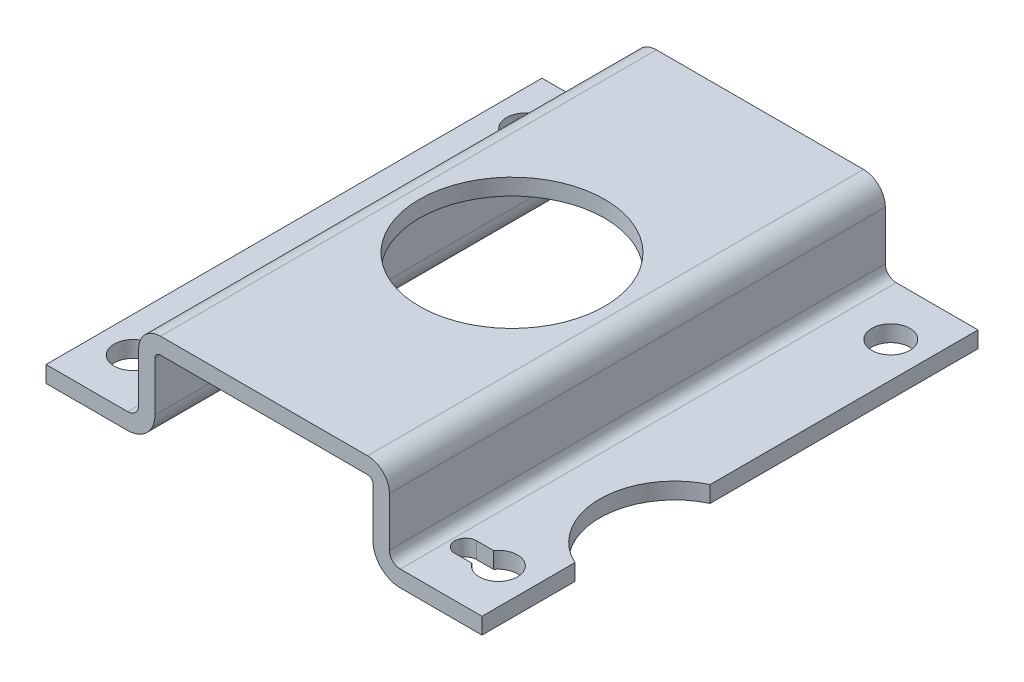
ISO-10303-21;
HEADER;
FILE_DESCRIPTION(('STEP AP214'),'2;1');
FILE_NAME('part.step','',(''),(''),'','','');
FILE_SCHEMA(('AUTOMOTIVE_DESIGN { 1 0 10303 214 1 1 1 1 }'));
ENDSEC;
DATA;
#1=APPLICATION_CONTEXT('core data for automotive mechanical design processes');
#2=APPLICATION_PROTOCOL_DEFINITION('international standard','automotive_design',2000,#1);
#3=PRODUCT_CONTEXT('',#1,'mechanical');
#4=PRODUCT('Part','Part','',(#3));
#5=PRODUCT_RELATED_PRODUCT_CATEGORY('part','',(#4));
#6=PRODUCT_DEFINITION_FORMATION('','',#4);
#7=PRODUCT_DEFINITION_CONTEXT('part definition',#1,'design');
#8=PRODUCT_DEFINITION('design','',#6,#7);
#9=PRODUCT_DEFINITION_SHAPE('','',#8);
#10=(LENGTH_UNIT() NAMED_UNIT(*) SI_UNIT(.MILLI.,.METRE.));
#11=(NAMED_UNIT(*) PLANE_ANGLE_UNIT() SI_UNIT($,.RADIAN.));
#12=(NAMED_UNIT(*) SI_UNIT($,.STERADIAN.) SOLID_ANGLE_UNIT());
#13=UNCERTAINTY_MEASURE_WITH_UNIT(LENGTH_MEASURE(1.E-05),#10,'distance_accuracy_value','');
#14=(GEOMETRIC_REPRESENTATION_CONTEXT(3) GLOBAL_UNCERTAINTY_ASSIGNED_CONTEXT((#13)) GLOBAL_UNIT_ASSIGNED_CONTEXT((#10,
#11,#12)) REPRESENTATION_CONTEXT('',''));
#15=CARTESIAN_POINT('',(0.,0.,0.));
#16=DIRECTION('',(0.,0.,1.));
#17=DIRECTION('',(1.,0.,0.));
#18=AXIS2_PLACEMENT_3D('',#15,#16,#17);
#19=CARTESIAN_POINT('',(40.,0.,45.5));
#20=DIRECTION('',(-1.,0.,0.));
#21=DIRECTION('',(0.,0.,1.));
#22=AXIS2_PLACEMENT_3D('',#19,#20,#21);
#23=PLANE('',#22);
#24=DIRECTION('',(0.,0.,-1.));
#25=VECTOR('',#24,1.);
#26=CARTESIAN_POINT('',(40.,3.,45.5));
#27=LINE('',#26,#25);
#28=CARTESIAN_POINT('',(40.,3.,3.6459415934201));
#29=VERTEX_POINT('',#28);
#30=CARTESIAN_POINT('',(40.,3.,-45.5));
#31=VERTEX_POINT('',#30);
#32=EDGE_CURVE('E472',#29,#31,#27,.T.);
#33=ORIENTED_EDGE('',*,*,#32,.F.);
#34=DIRECTION('',(0.,-1.,0.));
#35=VECTOR('',#34,1.);
#36=CARTESIAN_POINT('',(40.,10.,3.6459415934201));
#37=LINE('',#36,#35);
#38=CARTESIAN_POINT('',(40.,0.,3.6459415934201));
#39=VERTEX_POINT('',#38);
#40=EDGE_CURVE('E51',#29,#39,#37,.T.);
#41=ORIENTED_EDGE('',*,*,#40,.T.);
#42=DIRECTION('',(0.,0.,-1.));
#43=VECTOR('',#42,1.);
#44=CARTESIAN_POINT('',(40.,0.,45.5));
#45=LINE('',#44,#43);
#46=CARTESIAN_POINT('',(40.,0.,-45.5));
#47=VERTEX_POINT('',#46);
#48=EDGE_CURVE('E248',#39,#47,#45,.T.);
#49=ORIENTED_EDGE('',*,*,#48,.T.);
#50=DIRECTION('',(0.,1.,0.));
#51=VECTOR('',#50,1.);
#52=CARTESIAN_POINT('',(40.,0.,-45.5));
#53=LINE('',#52,#51);
#54=EDGE_CURVE('E445',#47,#31,#53,.T.);
#55=ORIENTED_EDGE('',*,*,#54,.T.);
#56=EDGE_LOOP('',(#33,#41,#49,#55));
#57=FACE_BOUND('',#56,.T.);
#58=ADVANCED_FACE('F35',(#57),#23,.F.);
#59=CARTESIAN_POINT('',(20.,0.,45.5));
#60=DIRECTION('',(-1.,0.,0.));
#61=DIRECTION('',(0.,0.,1.));
#62=AXIS2_PLACEMENT_3D('',#59,#60,#61);
#63=PLANE('',#62);
#64=DIRECTION('',(0.,1.,0.));
#65=VECTOR('',#64,1.);
#66=CARTESIAN_POINT('',(20.,0.,-45.5));
#67=LINE('',#66,#65);
#68=CARTESIAN_POINT('',(20.,5.,-45.5));
#69=VERTEX_POINT('',#68);
#70=CARTESIAN_POINT('',(20.,14.,-45.5));
#71=VERTEX_POINT('',#70);
#72=EDGE_CURVE('E409',#69,#71,#67,.T.);
#73=ORIENTED_EDGE('',*,*,#72,.F.);
#74=DIRECTION('',(0.,0.,-1.));
#75=VECTOR('',#74,1.);
#76=CARTESIAN_POINT('',(20.,5.,45.5));
#77=LINE('',#76,#75);
#78=CARTESIAN_POINT('',(20.,5.,45.5));
#79=VERTEX_POINT('',#78);
#80=EDGE_CURVE('E307',#69,#79,#77,.F.);
#81=ORIENTED_EDGE('',*,*,#80,.T.);
#82=DIRECTION('',(0.,1.,0.));
#83=VECTOR('',#82,1.);
#84=CARTESIAN_POINT('',(20.,0.,45.5));
#85=LINE('',#84,#83);
#86=CARTESIAN_POINT('',(20.,14.,45.5));
#87=VERTEX_POINT('',#86);
#88=EDGE_CURVE('E413',#79,#87,#85,.T.);
#89=ORIENTED_EDGE('',*,*,#88,.T.);
#90=DIRECTION('',(0.,0.,-1.));
#91=VECTOR('',#90,1.);
#92=CARTESIAN_POINT('',(20.,14.,-45.5));
#93=LINE('',#92,#91);
#94=EDGE_CURVE('E279',#87,#71,#93,.T.);
#95=ORIENTED_EDGE('',*,*,#94,.T.);
#96=EDGE_LOOP('',(#73,#81,#89,#95));
#97=FACE_BOUND('',#96,.T.);
#98=ADVANCED_FACE('F584',(#97),#63,.T.);
#99=CARTESIAN_POINT('',(40.,0.,45.5));
#100=DIRECTION('',(0.,-1.,0.));
#101=DIRECTION('',(0.,0.,-1.));
#102=AXIS2_PLACEMENT_3D('',#99,#100,#101);
#103=PLANE('',#102);
#104=CARTESIAN_POINT('',(45.9254076158377,0.,16.0657336464636));
#105=DIRECTION('',(0.,-1.,0.));
#106=DIRECTION('',(0.,0.,-1.));
#107=AXIS2_PLACEMENT_3D('',#104,#105,#106);
#108=CIRCLE('',#107,13.7608753375165);
#109=CARTESIAN_POINT('',(40.,0.,28.485525699507));
#110=VERTEX_POINT('',#109);
#111=EDGE_CURVE('E234',#110,#39,#108,.T.);
#112=ORIENTED_EDGE('',*,*,#111,.F.);
#113=CARTESIAN_POINT('',(40.,0.,45.5));
#114=VERTEX_POINT('',#113);
#115=EDGE_CURVE('E245',#114,#110,#45,.T.);
#116=ORIENTED_EDGE('',*,*,#115,.F.);
#117=DIRECTION('',(-1.,0.,0.));
#118=VECTOR('',#117,1.);
#119=CARTESIAN_POINT('',(40.,0.,45.5));
#120=LINE('',#119,#118);
#121=CARTESIAN_POINT('',(25.,0.,45.5));
#122=VERTEX_POINT('',#121);
#123=EDGE_CURVE('E416',#114,#122,#120,.T.);
#124=ORIENTED_EDGE('',*,*,#123,.T.);
#125=DIRECTION('',(0.,0.,-1.));
#126=VECTOR('',#125,1.);
#127=CARTESIAN_POINT('',(25.,0.,45.5));
#128=LINE('',#127,#126);
#129=CARTESIAN_POINT('',(25.,0.,-45.5));
#130=VERTEX_POINT('',#129);
#131=EDGE_CURVE('E300',#122,#130,#128,.T.);
#132=ORIENTED_EDGE('',*,*,#131,.T.);
#133=DIRECTION('',(-1.,0.,0.));
#134=VECTOR('',#133,1.);
#135=CARTESIAN_POINT('',(40.,0.,-45.5));
#136=LINE('',#135,#134);
#137=EDGE_CURVE('E442',#47,#130,#136,.T.);
#138=ORIENTED_EDGE('',*,*,#137,.F.);
#139=ORIENTED_EDGE('',*,*,#48,.F.);
#140=EDGE_LOOP('',(#112,#116,#124,#132,#138,#139));
#141=FACE_BOUND('',#140,.T.);
#142=CARTESIAN_POINT('',(27.5,0.,36.));
#143=DIRECTION('',(0.,-1.,0.));
#144=DIRECTION('',(0.,0.,1.));
#145=AXIS2_PLACEMENT_3D('',#142,#143,#144);
#146=CIRCLE('',#145,2.);
#147=CARTESIAN_POINT('',(27.5,0.,38.));
#148=VERTEX_POINT('',#147);
#149=CARTESIAN_POINT('',(27.5,0.,34.));
#150=VERTEX_POINT('',#149);
#151=EDGE_CURVE('E58',#148,#150,#146,.T.);
#152=ORIENTED_EDGE('',*,*,#151,.F.);
#153=DIRECTION('',(-1.,0.,0.));
#154=VECTOR('',#153,1.);
#155=CARTESIAN_POINT('',(27.5,0.,38.));
#156=LINE('',#155,#154);
#157=CARTESIAN_POINT('',(30.627718676731,0.,38.));
#158=VERTEX_POINT('',#157);
#159=EDGE_CURVE('E363',#158,#148,#156,.T.);
#160=ORIENTED_EDGE('',*,*,#159,.F.);
#161=CARTESIAN_POINT('',(33.5,0.,36.));
#162=DIRECTION('',(0.,-1.,0.));
#163=DIRECTION('',(0.,0.,-1.));
#164=AXIS2_PLACEMENT_3D('',#161,#162,#163);
#165=CIRCLE('',#164,3.49999999999999);
#166=CARTESIAN_POINT('',(30.627718676731,0.,34.));
#167=VERTEX_POINT('',#166);
#168=EDGE_CURVE('E563',#167,#158,#165,.T.);
#169=ORIENTED_EDGE('',*,*,#168,.F.);
#170=DIRECTION('',(1.,0.,0.));
#171=VECTOR('',#170,1.);
#172=CARTESIAN_POINT('',(27.5,0.,34.));
#173=LINE('',#172,#171);
#174=EDGE_CURVE('E559',#150,#167,#173,.T.);
#175=ORIENTED_EDGE('',*,*,#174,.F.);
#176=EDGE_LOOP('',(#152,#160,#169,#175));
#177=FACE_BOUND('',#176,.T.);
#178=CARTESIAN_POINT('',(33.5,0.,-36.));
#179=DIRECTION('',(0.,-1.,0.));
#180=DIRECTION('',(0.,0.,-1.));
#181=AXIS2_PLACEMENT_3D('',#178,#179,#180);
#182=CIRCLE('',#181,3.5);
#183=CARTESIAN_POINT('',(33.5,0.,-39.5));
#184=VERTEX_POINT('',#183);
#185=EDGE_CURVE('E341',#184,#184,#182,.T.);
#186=ORIENTED_EDGE('',*,*,#185,.F.);
#187=EDGE_LOOP('',(#186));
#188=FACE_BOUND('',#187,.T.);
#189=ADVANCED_FACE('F242',(#141,#177,#188),#103,.T.);
#190=ORIENTED_EDGE('',*,*,#115,.T.);
#191=DIRECTION('',(0.,-1.,0.));
#192=VECTOR('',#191,1.);
#193=CARTESIAN_POINT('',(40.,10.,28.485525699507));
#194=LINE('',#193,#192);
#195=CARTESIAN_POINT('',(40.,3.,28.485525699507));
#196=VERTEX_POINT('',#195);
#197=EDGE_CURVE('E231',#110,#196,#194,.F.);
#198=ORIENTED_EDGE('',*,*,#197,.T.);
#199=CARTESIAN_POINT('',(40.,3.,45.5));
#200=VERTEX_POINT('',#199);
#201=EDGE_CURVE('E257',#200,#196,#27,.T.);
#202=ORIENTED_EDGE('',*,*,#201,.F.);
#203=DIRECTION('',(0.,1.,0.));
#204=VECTOR('',#203,1.);
#205=CARTESIAN_POINT('',(40.,0.,45.5));
#206=LINE('',#205,#204);
#207=EDGE_CURVE('E251',#114,#200,#206,.T.);
#208=ORIENTED_EDGE('',*,*,#207,.F.);
#209=EDGE_LOOP('',(#190,#198,#202,#208));
#210=FACE_BOUND('',#209,.T.);
#211=ADVANCED_FACE('F250',(#210),#23,.F.);
#212=CARTESIAN_POINT('',(40.,3.,45.5));
#213=DIRECTION('',(0.,-1.,0.));
#214=DIRECTION('',(0.,0.,-1.));
#215=AXIS2_PLACEMENT_3D('',#212,#213,#214);
#216=PLANE('',#215);
#217=DIRECTION('',(-1.,0.,0.));
#218=VECTOR('',#217,1.);
#219=CARTESIAN_POINT('',(40.,3.,38.));
#220=LINE('',#219,#218);
#221=CARTESIAN_POINT('',(30.627718676731,3.,38.));
#222=VERTEX_POINT('',#221);
#223=CARTESIAN_POINT('',(27.5,3.,38.));
#224=VERTEX_POINT('',#223);
#225=EDGE_CURVE('E347',#222,#224,#220,.T.);
#226=ORIENTED_EDGE('',*,*,#225,.T.);
#227=CARTESIAN_POINT('',(27.5,3.,36.));
#228=DIRECTION('',(0.,-1.,0.));
#229=DIRECTION('',(0.,0.,-1.));
#230=AXIS2_PLACEMENT_3D('',#227,#228,#229);
#231=CIRCLE('',#230,2.);
#232=CARTESIAN_POINT('',(27.5,3.,34.));
#233=VERTEX_POINT('',#232);
#234=EDGE_CURVE('E44',#224,#233,#231,.T.);
#235=ORIENTED_EDGE('',*,*,#234,.T.);
#236=DIRECTION('',(1.,0.,0.));
#237=VECTOR('',#236,1.);
#238=CARTESIAN_POINT('',(40.,3.,34.));
#239=LINE('',#238,#237);
#240=CARTESIAN_POINT('',(30.627718676731,3.,34.));
#241=VERTEX_POINT('',#240);
#242=EDGE_CURVE('E336',#233,#241,#239,.T.);
#243=ORIENTED_EDGE('',*,*,#242,.T.);
#244=CARTESIAN_POINT('',(33.5,3.,36.));
#245=DIRECTION('',(0.,-1.,0.));
#246=DIRECTION('',(0.,0.,-1.));
#247=AXIS2_PLACEMENT_3D('',#244,#245,#246);
#248=CIRCLE('',#247,3.49999999999999);
#249=EDGE_CURVE('E344',#241,#222,#248,.T.);
#250=ORIENTED_EDGE('',*,*,#249,.T.);
#251=EDGE_LOOP('',(#226,#235,#243,#250));
#252=FACE_BOUND('',#251,.T.);
#253=CARTESIAN_POINT('',(33.5,3.,-36.));
#254=DIRECTION('',(0.,-1.,0.));
#255=DIRECTION('',(0.,0.,-1.));
#256=AXIS2_PLACEMENT_3D('',#253,#254,#255);
#257=CIRCLE('',#256,3.5);
#258=CARTESIAN_POINT('',(33.5,3.,-39.5));
#259=VERTEX_POINT('',#258);
#260=EDGE_CURVE('E337',#259,#259,#257,.T.);
#261=ORIENTED_EDGE('',*,*,#260,.T.);
#262=EDGE_LOOP('',(#261));
#263=FACE_BOUND('',#262,.T.);
#264=ORIENTED_EDGE('',*,*,#201,.T.);
#265=CARTESIAN_POINT('',(45.9254076158377,3.,16.0657336464636));
#266=DIRECTION('',(0.,-1.,0.));
#267=DIRECTION('',(0.,0.,-1.));
#268=AXIS2_PLACEMENT_3D('',#265,#266,#267);
#269=CIRCLE('',#268,13.7608753375165);
#270=EDGE_CURVE('E11',#196,#29,#269,.T.);
#271=ORIENTED_EDGE('',*,*,#270,.T.);
#272=ORIENTED_EDGE('',*,*,#32,.T.);
#273=DIRECTION('',(-1.,0.,0.));
#274=VECTOR('',#273,1.);
#275=CARTESIAN_POINT('',(40.,3.,-45.5));
#276=LINE('',#275,#274);
#277=CARTESIAN_POINT('',(25.,3.,-45.5));
#278=VERTEX_POINT('',#277);
#279=EDGE_CURVE('E448',#31,#278,#276,.T.);
#280=ORIENTED_EDGE('',*,*,#279,.T.);
#281=DIRECTION('',(0.,0.,-1.));
#282=VECTOR('',#281,1.);
#283=CARTESIAN_POINT('',(25.,3.,45.5));
#284=LINE('',#283,#282);
#285=CARTESIAN_POINT('',(25.,3.,45.5));
#286=VERTEX_POINT('',#285);
#287=EDGE_CURVE('E321',#278,#286,#284,.F.);
#288=ORIENTED_EDGE('',*,*,#287,.T.);
#289=DIRECTION('',(-1.,0.,0.));
#290=VECTOR('',#289,1.);
#291=CARTESIAN_POINT('',(40.,3.,45.5));
#292=LINE('',#291,#290);
#293=EDGE_CURVE('E419',#200,#286,#292,.T.);
#294=ORIENTED_EDGE('',*,*,#293,.F.);
#295=EDGE_LOOP('',(#264,#271,#272,#280,#288,#294));
#296=FACE_BOUND('',#295,.T.);
#297=ADVANCED_FACE('F352',(#252,#263,#296),#216,.F.);
#298=CARTESIAN_POINT('',(23.,3.,45.5));
#299=DIRECTION('',(-1.,0.,0.));
#300=DIRECTION('',(0.,0.,1.));
#301=AXIS2_PLACEMENT_3D('',#298,#299,#300);
#302=PLANE('',#301);
#303=DIRECTION('',(0.,1.,0.));
#304=VECTOR('',#303,1.);
#305=CARTESIAN_POINT('',(23.,3.,45.5));
#306=LINE('',#305,#304);
#307=CARTESIAN_POINT('',(23.,5.,45.5));
#308=VERTEX_POINT('',#307);
#309=CARTESIAN_POINT('',(23.,14.,45.5));
#310=VERTEX_POINT('',#309);
#311=EDGE_CURVE('E422',#308,#310,#306,.T.);
#312=ORIENTED_EDGE('',*,*,#311,.F.);
#313=DIRECTION('',(0.,0.,-1.));
#314=VECTOR('',#313,1.);
#315=CARTESIAN_POINT('',(23.,5.,-45.5));
#316=LINE('',#315,#314);
#317=CARTESIAN_POINT('',(23.,5.,-45.5));
#318=VERTEX_POINT('',#317);
#319=EDGE_CURVE('E318',#308,#318,#316,.T.);
#320=ORIENTED_EDGE('',*,*,#319,.T.);
#321=DIRECTION('',(0.,1.,0.));
#322=VECTOR('',#321,1.);
#323=CARTESIAN_POINT('',(23.,3.,-45.5));
#324=LINE('',#323,#322);
#325=CARTESIAN_POINT('',(23.,14.,-45.5));
#326=VERTEX_POINT('',#325);
#327=EDGE_CURVE('E451',#318,#326,#324,.T.);
#328=ORIENTED_EDGE('',*,*,#327,.T.);
#329=DIRECTION('',(0.,0.,-1.));
#330=VECTOR('',#329,1.);
#331=CARTESIAN_POINT('',(23.,14.,45.5));
#332=LINE('',#331,#330);
#333=EDGE_CURVE('E268',#326,#310,#332,.F.);
#334=ORIENTED_EDGE('',*,*,#333,.T.);
#335=EDGE_LOOP('',(#312,#320,#328,#334));
#336=FACE_BOUND('',#335,.T.);
#337=ADVANCED_FACE('F490',(#336),#302,.F.);
#338=CARTESIAN_POINT('',(0.,18.,45.5));
#339=DIRECTION('',(0.,-1.,0.));
#340=DIRECTION('',(1.,0.,0.));
#341=AXIS2_PLACEMENT_3D('',#338,#339,#340);
#342=PLANE('',#341);
#343=CARTESIAN_POINT('',(0.,18.,0.));
#344=DIRECTION('',(0.,1.,0.));
#345=DIRECTION('',(-1.,0.,0.));
#346=AXIS2_PLACEMENT_3D('',#343,#344,#345);
#347=CIRCLE('',#346,17.);
#348=CARTESIAN_POINT('',(-17.,18.,0.));
#349=VERTEX_POINT('',#348);
#350=EDGE_CURVE('E822',#349,#349,#347,.T.);
#351=ORIENTED_EDGE('',*,*,#350,.F.);
#352=EDGE_LOOP('',(#351));
#353=FACE_BOUND('',#352,.T.);
#354=DIRECTION('',(1.,0.,0.));
#355=VECTOR('',#354,1.);
#356=CARTESIAN_POINT('',(0.,18.,45.5));
#357=LINE('',#356,#355);
#358=CARTESIAN_POINT('',(-19.,18.,45.5));
#359=VERTEX_POINT('',#358);
#360=CARTESIAN_POINT('',(19.,18.,45.5));
#361=VERTEX_POINT('',#360);
#362=EDGE_CURVE('E424',#359,#361,#357,.T.);
#363=ORIENTED_EDGE('',*,*,#362,.T.);
#364=DIRECTION('',(0.,0.,-1.));
#365=VECTOR('',#364,1.);
#366=CARTESIAN_POINT('',(19.,18.,45.5));
#367=LINE('',#366,#365);
#368=CARTESIAN_POINT('',(19.,18.,-45.5));
#369=VERTEX_POINT('',#368);
#370=EDGE_CURVE('E255',#361,#369,#367,.T.);
#371=ORIENTED_EDGE('',*,*,#370,.T.);
#372=DIRECTION('',(-1.,0.,0.));
#373=VECTOR('',#372,1.);
#374=CARTESIAN_POINT('',(0.,18.,-45.5));
#375=LINE('',#374,#373);
#376=CARTESIAN_POINT('',(-19.,18.,-45.5));
#377=VERTEX_POINT('',#376);
#378=EDGE_CURVE('E453',#369,#377,#375,.T.);
#379=ORIENTED_EDGE('',*,*,#378,.T.);
#380=DIRECTION('',(0.,0.,-1.));
#381=VECTOR('',#380,1.);
#382=CARTESIAN_POINT('',(-19.,18.,45.5));
#383=LINE('',#382,#381);
#384=EDGE_CURVE('E253',#377,#359,#383,.F.);
#385=ORIENTED_EDGE('',*,*,#384,.T.);
#386=EDGE_LOOP('',(#363,#371,#379,#385));
#387=FACE_BOUND('',#386,.T.);
#388=ADVANCED_FACE('F503',(#353,#387),#342,.F.);
#389=CARTESIAN_POINT('',(-23.,3.,45.5));
#390=DIRECTION('',(-1.,0.,0.));
#391=DIRECTION('',(0.,0.,1.));
#392=AXIS2_PLACEMENT_3D('',#389,#390,#391);
#393=PLANE('',#392);
#394=DIRECTION('',(0.,1.,0.));
#395=VECTOR('',#394,1.);
#396=CARTESIAN_POINT('',(-23.,3.,-45.5));
#397=LINE('',#396,#395);
#398=CARTESIAN_POINT('',(-23.,5.,-45.5));
#399=VERTEX_POINT('',#398);
#400=CARTESIAN_POINT('',(-23.,14.,-45.5));
#401=VERTEX_POINT('',#400);
#402=EDGE_CURVE('E456',#399,#401,#397,.T.);
#403=ORIENTED_EDGE('',*,*,#402,.F.);
#404=DIRECTION('',(0.,0.,-1.));
#405=VECTOR('',#404,1.);
#406=CARTESIAN_POINT('',(-23.,5.,45.5));
#407=LINE('',#406,#405);
#408=CARTESIAN_POINT('',(-23.,5.,45.5));
#409=VERTEX_POINT('',#408);
#410=EDGE_CURVE('E326',#399,#409,#407,.F.);
#411=ORIENTED_EDGE('',*,*,#410,.T.);
#412=DIRECTION('',(0.,1.,0.));
#413=VECTOR('',#412,1.);
#414=CARTESIAN_POINT('',(-23.,3.,45.5));
#415=LINE('',#414,#413);
#416=CARTESIAN_POINT('',(-23.,14.,45.5));
#417=VERTEX_POINT('',#416);
#418=EDGE_CURVE('E427',#409,#417,#415,.T.);
#419=ORIENTED_EDGE('',*,*,#418,.T.);
#420=DIRECTION('',(0.,0.,-1.));
#421=VECTOR('',#420,1.);
#422=CARTESIAN_POINT('',(-23.,14.,-45.5));
#423=LINE('',#422,#421);
#424=EDGE_CURVE('E276',#417,#401,#423,.T.);
#425=ORIENTED_EDGE('',*,*,#424,.T.);
#426=EDGE_LOOP('',(#403,#411,#419,#425));
#427=FACE_BOUND('',#426,.T.);
#428=ADVANCED_FACE('F648',(#427),#393,.T.);
#429=CARTESIAN_POINT('',(-40.,3.,45.5));
#430=DIRECTION('',(0.,1.,0.));
#431=DIRECTION('',(0.,0.,1.));
#432=AXIS2_PLACEMENT_3D('',#429,#430,#431);
#433=PLANE('',#432);
#434=CARTESIAN_POINT('',(-33.5,3.,-36.));
#435=DIRECTION('',(0.,1.,0.));
#436=DIRECTION('',(0.,0.,1.));
#437=AXIS2_PLACEMENT_3D('',#434,#435,#436);
#438=CIRCLE('',#437,3.5);
#439=CARTESIAN_POINT('',(-33.5,3.,-32.5));
#440=VERTEX_POINT('',#439);
#441=EDGE_CURVE('E377',#440,#440,#438,.T.);
#442=ORIENTED_EDGE('',*,*,#441,.F.);
#443=EDGE_LOOP('',(#442));
#444=FACE_BOUND('',#443,.T.);
#445=CARTESIAN_POINT('',(-33.5,3.,36.));
#446=DIRECTION('',(0.,1.,0.));
#447=DIRECTION('',(0.,0.,1.));
#448=AXIS2_PLACEMENT_3D('',#445,#446,#447);
#449=CIRCLE('',#448,3.5);
#450=CARTESIAN_POINT('',(-30.627718676731,3.,34.));
#451=VERTEX_POINT('',#450);
#452=CARTESIAN_POINT('',(-30.627718676731,3.,38.));
#453=VERTEX_POINT('',#452);
#454=EDGE_CURVE('E407',#451,#453,#449,.T.);
#455=ORIENTED_EDGE('',*,*,#454,.F.);
#456=DIRECTION('',(-1.,0.,0.));
#457=VECTOR('',#456,1.);
#458=CARTESIAN_POINT('',(-40.,3.,34.));
#459=LINE('',#458,#457);
#460=CARTESIAN_POINT('',(-27.5,3.,34.));
#461=VERTEX_POINT('',#460);
#462=EDGE_CURVE('E394',#461,#451,#459,.T.);
#463=ORIENTED_EDGE('',*,*,#462,.F.);
#464=CARTESIAN_POINT('',(-27.5,3.,36.));
#465=DIRECTION('',(0.,1.,0.));
#466=DIRECTION('',(0.,0.,1.));
#467=AXIS2_PLACEMENT_3D('',#464,#465,#466);
#468=CIRCLE('',#467,2.);
#469=CARTESIAN_POINT('',(-27.5,3.,38.));
#470=VERTEX_POINT('',#469);
#471=EDGE_CURVE('E402',#470,#461,#468,.T.);
#472=ORIENTED_EDGE('',*,*,#471,.F.);
#473=DIRECTION('',(1.,0.,0.));
#474=VECTOR('',#473,1.);
#475=CARTESIAN_POINT('',(-40.,3.,38.));
#476=LINE('',#475,#474);
#477=EDGE_CURVE('E405',#453,#470,#476,.T.);
#478=ORIENTED_EDGE('',*,*,#477,.F.);
#479=EDGE_LOOP('',(#455,#463,#472,#478));
#480=FACE_BOUND('',#479,.T.);
#481=DIRECTION('',(1.,0.,0.));
#482=VECTOR('',#481,1.);
#483=CARTESIAN_POINT('',(-40.,3.,45.5));
#484=LINE('',#483,#482);
#485=CARTESIAN_POINT('',(-40.,3.,45.5));
#486=VERTEX_POINT('',#485);
#487=CARTESIAN_POINT('',(-25.,3.,45.5));
#488=VERTEX_POINT('',#487);
#489=EDGE_CURVE('E429',#486,#488,#484,.T.);
#490=ORIENTED_EDGE('',*,*,#489,.T.);
#491=DIRECTION('',(0.,0.,-1.));
#492=VECTOR('',#491,1.);
#493=CARTESIAN_POINT('',(-25.,3.,-45.5));
#494=LINE('',#493,#492);
#495=CARTESIAN_POINT('',(-25.,3.,-45.5));
#496=VERTEX_POINT('',#495);
#497=EDGE_CURVE('E323',#488,#496,#494,.T.);
#498=ORIENTED_EDGE('',*,*,#497,.T.);
#499=DIRECTION('',(1.,0.,0.));
#500=VECTOR('',#499,1.);
#501=CARTESIAN_POINT('',(-40.,3.,-45.5));
#502=LINE('',#501,#500);
#503=CARTESIAN_POINT('',(-40.,3.,-45.5));
#504=VERTEX_POINT('',#503);
#505=EDGE_CURVE('E458',#504,#496,#502,.T.);
#506=ORIENTED_EDGE('',*,*,#505,.F.);
#507=DIRECTION('',(0.,0.,-1.));
#508=VECTOR('',#507,1.);
#509=CARTESIAN_POINT('',(-40.,3.,45.5));
#510=LINE('',#509,#508);
#511=EDGE_CURVE('E471',#486,#504,#510,.T.);
#512=ORIENTED_EDGE('',*,*,#511,.F.);
#513=EDGE_LOOP('',(#490,#498,#506,#512));
#514=FACE_BOUND('',#513,.T.);
#515=ADVANCED_FACE('F517',(#444,#480,#514),#433,.T.);
#516=CARTESIAN_POINT('',(-40.,0.,45.5));
#517=DIRECTION('',(-1.,0.,0.));
#518=DIRECTION('',(0.,0.,1.));
#519=AXIS2_PLACEMENT_3D('',#516,#517,#518);
#520=PLANE('',#519);
#521=DIRECTION('',(0.,1.,0.));
#522=VECTOR('',#521,1.);
#523=CARTESIAN_POINT('',(-40.,0.,-45.5));
#524=LINE('',#523,#522);
#525=CARTESIAN_POINT('',(-40.,0.,-45.5));
#526=VERTEX_POINT('',#525);
#527=EDGE_CURVE('E461',#526,#504,#524,.T.);
#528=ORIENTED_EDGE('',*,*,#527,.F.);
#529=DIRECTION('',(0.,0.,-1.));
#530=VECTOR('',#529,1.);
#531=CARTESIAN_POINT('',(-40.,0.,45.5));
#532=LINE('',#531,#530);
#533=CARTESIAN_POINT('',(-40.,0.,45.5));
#534=VERTEX_POINT('',#533);
#535=EDGE_CURVE('E440',#534,#526,#532,.T.);
#536=ORIENTED_EDGE('',*,*,#535,.F.);
#537=DIRECTION('',(0.,1.,0.));
#538=VECTOR('',#537,1.);
#539=CARTESIAN_POINT('',(-40.,0.,45.5));
#540=LINE('',#539,#538);
#541=EDGE_CURVE('E432',#534,#486,#540,.T.);
#542=ORIENTED_EDGE('',*,*,#541,.T.);
#543=ORIENTED_EDGE('',*,*,#511,.T.);
#544=EDGE_LOOP('',(#528,#536,#542,#543));
#545=FACE_BOUND('',#544,.T.);
#546=ADVANCED_FACE('F520',(#545),#520,.T.);
#547=CARTESIAN_POINT('',(-40.,0.,45.5));
#548=DIRECTION('',(0.,1.,0.));
#549=DIRECTION('',(0.,0.,1.));
#550=AXIS2_PLACEMENT_3D('',#547,#548,#549);
#551=PLANE('',#550);
#552=CARTESIAN_POINT('',(-33.5,0.,-36.));
#553=DIRECTION('',(0.,-1.,0.));
#554=DIRECTION('',(0.,0.,-1.));
#555=AXIS2_PLACEMENT_3D('',#552,#553,#554);
#556=CIRCLE('',#555,3.5);
#557=CARTESIAN_POINT('',(-33.5,0.,-39.5));
#558=VERTEX_POINT('',#557);
#559=EDGE_CURVE('E340',#558,#558,#556,.T.);
#560=ORIENTED_EDGE('',*,*,#559,.F.);
#561=EDGE_LOOP('',(#560));
#562=FACE_BOUND('',#561,.T.);
#563=DIRECTION('',(1.,0.,0.));
#564=VECTOR('',#563,1.);
#565=CARTESIAN_POINT('',(-27.5,0.,34.));
#566=LINE('',#565,#564);
#567=CARTESIAN_POINT('',(-30.627718676731,0.,34.));
#568=VERTEX_POINT('',#567);
#569=CARTESIAN_POINT('',(-27.5,0.,34.));
#570=VERTEX_POINT('',#569);
#571=EDGE_CURVE('E382',#568,#570,#566,.T.);
#572=ORIENTED_EDGE('',*,*,#571,.F.);
#573=CARTESIAN_POINT('',(-33.5,0.,36.));
#574=DIRECTION('',(0.,-1.,0.));
#575=DIRECTION('',(0.,0.,-1.));
#576=AXIS2_PLACEMENT_3D('',#573,#574,#575);
#577=CIRCLE('',#576,3.5);
#578=CARTESIAN_POINT('',(-30.627718676731,0.,38.));
#579=VERTEX_POINT('',#578);
#580=EDGE_CURVE('E380',#579,#568,#577,.T.);
#581=ORIENTED_EDGE('',*,*,#580,.F.);
#582=DIRECTION('',(-1.,0.,0.));
#583=VECTOR('',#582,1.);
#584=CARTESIAN_POINT('',(-27.5,0.,38.));
#585=LINE('',#584,#583);
#586=CARTESIAN_POINT('',(-27.5,0.,38.));
#587=VERTEX_POINT('',#586);
#588=EDGE_CURVE('E388',#587,#579,#585,.T.);
#589=ORIENTED_EDGE('',*,*,#588,.F.);
#590=CARTESIAN_POINT('',(-27.5,0.,36.));
#591=DIRECTION('',(0.,-1.,0.));
#592=DIRECTION('',(0.,0.,-1.));
#593=AXIS2_PLACEMENT_3D('',#590,#591,#592);
#594=CIRCLE('',#593,2.);
#595=EDGE_CURVE('E385',#570,#587,#594,.T.);
#596=ORIENTED_EDGE('',*,*,#595,.F.);
#597=EDGE_LOOP('',(#572,#581,#589,#596));
#598=FACE_BOUND('',#597,.T.);
#599=DIRECTION('',(1.,0.,0.));
#600=VECTOR('',#599,1.);
#601=CARTESIAN_POINT('',(-40.,0.,-45.5));
#602=LINE('',#601,#600);
#603=CARTESIAN_POINT('',(-25.,0.,-45.5));
#604=VERTEX_POINT('',#603);
#605=EDGE_CURVE('E464',#526,#604,#602,.T.);
#606=ORIENTED_EDGE('',*,*,#605,.T.);
#607=DIRECTION('',(0.,0.,-1.));
#608=VECTOR('',#607,1.);
#609=CARTESIAN_POINT('',(-25.,0.,45.5));
#610=LINE('',#609,#608);
#611=CARTESIAN_POINT('',(-25.,0.,45.5));
#612=VERTEX_POINT('',#611);
#613=EDGE_CURVE('E316',#604,#612,#610,.F.);
#614=ORIENTED_EDGE('',*,*,#613,.T.);
#615=DIRECTION('',(1.,0.,0.));
#616=VECTOR('',#615,1.);
#617=CARTESIAN_POINT('',(-40.,0.,45.5));
#618=LINE('',#617,#616);
#619=EDGE_CURVE('E435',#534,#612,#618,.T.);
#620=ORIENTED_EDGE('',*,*,#619,.F.);
#621=ORIENTED_EDGE('',*,*,#535,.T.);
#622=EDGE_LOOP('',(#606,#614,#620,#621));
#623=FACE_BOUND('',#622,.T.);
#624=ADVANCED_FACE('F524',(#562,#598,#623),#551,.F.);
#625=CARTESIAN_POINT('',(-20.,0.,45.5));
#626=DIRECTION('',(-1.,0.,0.));
#627=DIRECTION('',(0.,-1.,0.));
#628=AXIS2_PLACEMENT_3D('',#625,#626,#627);
#629=PLANE('',#628);
#630=DIRECTION('',(0.,1.,0.));
#631=VECTOR('',#630,1.);
#632=CARTESIAN_POINT('',(-20.,0.,45.5));
#633=LINE('',#632,#631);
#634=CARTESIAN_POINT('',(-20.,5.,45.5));
#635=VERTEX_POINT('',#634);
#636=CARTESIAN_POINT('',(-20.,14.,45.5));
#637=VERTEX_POINT('',#636);
#638=EDGE_CURVE('E438',#635,#637,#633,.T.);
#639=ORIENTED_EDGE('',*,*,#638,.F.);
#640=DIRECTION('',(0.,0.,-1.));
#641=VECTOR('',#640,1.);
#642=CARTESIAN_POINT('',(-20.,5.,45.5));
#643=LINE('',#642,#641);
#644=CARTESIAN_POINT('',(-20.,5.,-45.5));
#645=VERTEX_POINT('',#644);
#646=EDGE_CURVE('E313',#635,#645,#643,.T.);
#647=ORIENTED_EDGE('',*,*,#646,.T.);
#648=DIRECTION('',(0.,1.,0.));
#649=VECTOR('',#648,1.);
#650=CARTESIAN_POINT('',(-20.,0.,-45.5));
#651=LINE('',#650,#649);
#652=CARTESIAN_POINT('',(-20.,14.,-45.5));
#653=VERTEX_POINT('',#652);
#654=EDGE_CURVE('E467',#645,#653,#651,.T.);
#655=ORIENTED_EDGE('',*,*,#654,.T.);
#656=DIRECTION('',(0.,0.,-1.));
#657=VECTOR('',#656,1.);
#658=CARTESIAN_POINT('',(-20.,14.,45.5));
#659=LINE('',#658,#657);
#660=EDGE_CURVE('E287',#653,#637,#659,.F.);
#661=ORIENTED_EDGE('',*,*,#660,.T.);
#662=EDGE_LOOP('',(#639,#647,#655,#661));
#663=FACE_BOUND('',#662,.T.);
#664=ADVANCED_FACE('F533',(#663),#629,.F.);
#665=CARTESIAN_POINT('',(0.,15.,45.5));
#666=DIRECTION('',(0.,-1.,0.));
#667=DIRECTION('',(1.,0.,0.));
#668=AXIS2_PLACEMENT_3D('',#665,#666,#667);
#669=PLANE('',#668);
#670=CARTESIAN_POINT('',(0.,15.,0.));
#671=DIRECTION('',(0.,-1.,0.));
#672=DIRECTION('',(1.,0.,0.));
#673=AXIS2_PLACEMENT_3D('',#670,#671,#672);
#674=CIRCLE('',#673,17.);
#675=CARTESIAN_POINT('',(17.,15.,0.));
#676=VERTEX_POINT('',#675);
#677=EDGE_CURVE('E39',#676,#676,#674,.T.);
#678=ORIENTED_EDGE('',*,*,#677,.F.);
#679=EDGE_LOOP('',(#678));
#680=FACE_BOUND('',#679,.T.);
#681=DIRECTION('',(-1.,0.,0.));
#682=VECTOR('',#681,1.);
#683=CARTESIAN_POINT('',(0.,15.,-45.5));
#684=LINE('',#683,#682);
#685=CARTESIAN_POINT('',(19.,15.,-45.5));
#686=VERTEX_POINT('',#685);
#687=CARTESIAN_POINT('',(-19.,15.,-45.5));
#688=VERTEX_POINT('',#687);
#689=EDGE_CURVE('E414',#686,#688,#684,.T.);
#690=ORIENTED_EDGE('',*,*,#689,.F.);
#691=DIRECTION('',(0.,0.,-1.));
#692=VECTOR('',#691,1.);
#693=CARTESIAN_POINT('',(19.,15.,45.5));
#694=LINE('',#693,#692);
#695=CARTESIAN_POINT('',(19.,15.,45.5));
#696=VERTEX_POINT('',#695);
#697=EDGE_CURVE('E285',#686,#696,#694,.F.);
#698=ORIENTED_EDGE('',*,*,#697,.T.);
#699=DIRECTION('',(1.,0.,0.));
#700=VECTOR('',#699,1.);
#701=CARTESIAN_POINT('',(0.,15.,45.5));
#702=LINE('',#701,#700);
#703=CARTESIAN_POINT('',(-19.,15.,45.5));
#704=VERTEX_POINT('',#703);
#705=EDGE_CURVE('E410',#704,#696,#702,.T.);
#706=ORIENTED_EDGE('',*,*,#705,.F.);
#707=DIRECTION('',(0.,0.,-1.));
#708=VECTOR('',#707,1.);
#709=CARTESIAN_POINT('',(-19.,15.,45.5));
#710=LINE('',#709,#708);
#711=EDGE_CURVE('E282',#704,#688,#710,.T.);
#712=ORIENTED_EDGE('',*,*,#711,.T.);
#713=EDGE_LOOP('',(#690,#698,#706,#712));
#714=FACE_BOUND('',#713,.T.);
#715=ADVANCED_FACE('F543',(#680,#714),#669,.T.);
#716=CARTESIAN_POINT('',(0.,0.,45.5));
#717=DIRECTION('',(0.,0.,1.));
#718=DIRECTION('',(1.,0.,0.));
#719=AXIS2_PLACEMENT_3D('',#716,#717,#718);
#720=PLANE('',#719);
#721=ORIENTED_EDGE('',*,*,#88,.F.);
#722=CARTESIAN_POINT('',(25.,5.,45.5));
#723=DIRECTION('',(0.,0.,1.));
#724=DIRECTION('',(1.,0.,0.));
#725=AXIS2_PLACEMENT_3D('',#722,#723,#724);
#726=CIRCLE('',#725,5.);
#727=EDGE_CURVE('E311',#79,#122,#726,.T.);
#728=ORIENTED_EDGE('',*,*,#727,.T.);
#729=ORIENTED_EDGE('',*,*,#123,.F.);
#730=ORIENTED_EDGE('',*,*,#207,.T.);
#731=ORIENTED_EDGE('',*,*,#293,.T.);
#732=CARTESIAN_POINT('',(25.,5.,45.5));
#733=DIRECTION('',(0.,0.,1.));
#734=DIRECTION('',(1.,0.,0.));
#735=AXIS2_PLACEMENT_3D('',#732,#733,#734);
#736=CIRCLE('',#735,2.);
#737=EDGE_CURVE('E330',#286,#308,#736,.F.);
#738=ORIENTED_EDGE('',*,*,#737,.T.);
#739=ORIENTED_EDGE('',*,*,#311,.T.);
#740=CARTESIAN_POINT('',(19.,14.,45.5));
#741=DIRECTION('',(0.,0.,1.));
#742=DIRECTION('',(1.,0.,0.));
#743=AXIS2_PLACEMENT_3D('',#740,#741,#742);
#744=CIRCLE('',#743,4.);
#745=EDGE_CURVE('E274',#310,#361,#744,.T.);
#746=ORIENTED_EDGE('',*,*,#745,.T.);
#747=ORIENTED_EDGE('',*,*,#362,.F.);
#748=CARTESIAN_POINT('',(-19.,14.,45.5));
#749=DIRECTION('',(0.,0.,1.));
#750=DIRECTION('',(1.,0.,0.));
#751=AXIS2_PLACEMENT_3D('',#748,#749,#750);
#752=CIRCLE('',#751,4.);
#753=EDGE_CURVE('E271',#359,#417,#752,.T.);
#754=ORIENTED_EDGE('',*,*,#753,.T.);
#755=ORIENTED_EDGE('',*,*,#418,.F.);
#756=CARTESIAN_POINT('',(-25.,5.,45.5));
#757=DIRECTION('',(0.,0.,1.));
#758=DIRECTION('',(1.,0.,0.));
#759=AXIS2_PLACEMENT_3D('',#756,#757,#758);
#760=CIRCLE('',#759,2.);
#761=EDGE_CURVE('E334',#409,#488,#760,.F.);
#762=ORIENTED_EDGE('',*,*,#761,.T.);
#763=ORIENTED_EDGE('',*,*,#489,.F.);
#764=ORIENTED_EDGE('',*,*,#541,.F.);
#765=ORIENTED_EDGE('',*,*,#619,.T.);
#766=CARTESIAN_POINT('',(-25.,5.,45.5));
#767=DIRECTION('',(0.,0.,1.));
#768=DIRECTION('',(1.,0.,0.));
#769=AXIS2_PLACEMENT_3D('',#766,#767,#768);
#770=CIRCLE('',#769,5.);
#771=EDGE_CURVE('E309',#612,#635,#770,.T.);
#772=ORIENTED_EDGE('',*,*,#771,.T.);
#773=ORIENTED_EDGE('',*,*,#638,.T.);
#774=CARTESIAN_POINT('',(-19.,14.,45.5));
#775=DIRECTION('',(0.,0.,1.));
#776=DIRECTION('',(1.,0.,0.));
#777=AXIS2_PLACEMENT_3D('',#774,#775,#776);
#778=CIRCLE('',#777,1.);
#779=EDGE_CURVE('E298',#637,#704,#778,.F.);
#780=ORIENTED_EDGE('',*,*,#779,.T.);
#781=ORIENTED_EDGE('',*,*,#705,.T.);
#782=CARTESIAN_POINT('',(19.,14.,45.5));
#783=DIRECTION('',(0.,0.,1.));
#784=DIRECTION('',(1.,0.,0.));
#785=AXIS2_PLACEMENT_3D('',#782,#783,#784);
#786=CIRCLE('',#785,1.);
#787=EDGE_CURVE('E292',#696,#87,#786,.F.);
#788=ORIENTED_EDGE('',*,*,#787,.T.);
#789=EDGE_LOOP('',(#721,#728,#729,#730,#731,#738,#739,#746,#747,#754,#755,#762,#763,#764,#765,
#772,#773,#780,#781,#788));
#790=FACE_BOUND('',#789,.T.);
#791=ADVANCED_FACE('F483',(#790),#720,.T.);
#792=CARTESIAN_POINT('',(0.,0.,-45.5));
#793=DIRECTION('',(0.,0.,1.));
#794=DIRECTION('',(1.,0.,0.));
#795=AXIS2_PLACEMENT_3D('',#792,#793,#794);
#796=PLANE('',#795);
#797=ORIENTED_EDGE('',*,*,#137,.T.);
#798=CARTESIAN_POINT('',(25.,5.,-45.5));
#799=DIRECTION('',(0.,0.,1.));
#800=DIRECTION('',(1.,0.,0.));
#801=AXIS2_PLACEMENT_3D('',#798,#799,#800);
#802=CIRCLE('',#801,5.);
#803=EDGE_CURVE('E305',#130,#69,#802,.F.);
#804=ORIENTED_EDGE('',*,*,#803,.T.);
#805=ORIENTED_EDGE('',*,*,#72,.T.);
#806=CARTESIAN_POINT('',(19.,14.,-45.5));
#807=DIRECTION('',(0.,0.,1.));
#808=DIRECTION('',(1.,0.,0.));
#809=AXIS2_PLACEMENT_3D('',#806,#807,#808);
#810=CIRCLE('',#809,1.);
#811=EDGE_CURVE('E290',#71,#686,#810,.T.);
#812=ORIENTED_EDGE('',*,*,#811,.T.);
#813=ORIENTED_EDGE('',*,*,#689,.T.);
#814=CARTESIAN_POINT('',(-19.,14.,-45.5));
#815=DIRECTION('',(0.,0.,1.));
#816=DIRECTION('',(1.,0.,0.));
#817=AXIS2_PLACEMENT_3D('',#814,#815,#816);
#818=CIRCLE('',#817,1.);
#819=EDGE_CURVE('E295',#688,#653,#818,.T.);
#820=ORIENTED_EDGE('',*,*,#819,.T.);
#821=ORIENTED_EDGE('',*,*,#654,.F.);
#822=CARTESIAN_POINT('',(-25.,5.,-45.5));
#823=DIRECTION('',(0.,0.,1.));
#824=DIRECTION('',(1.,0.,0.));
#825=AXIS2_PLACEMENT_3D('',#822,#823,#824);
#826=CIRCLE('',#825,5.);
#827=EDGE_CURVE('E303',#645,#604,#826,.F.);
#828=ORIENTED_EDGE('',*,*,#827,.T.);
#829=ORIENTED_EDGE('',*,*,#605,.F.);
#830=ORIENTED_EDGE('',*,*,#527,.T.);
#831=ORIENTED_EDGE('',*,*,#505,.T.);
#832=CARTESIAN_POINT('',(-25.,5.,-45.5));
#833=DIRECTION('',(0.,0.,1.));
#834=DIRECTION('',(1.,0.,0.));
#835=AXIS2_PLACEMENT_3D('',#832,#833,#834);
#836=CIRCLE('',#835,2.);
#837=EDGE_CURVE('E332',#496,#399,#836,.T.);
#838=ORIENTED_EDGE('',*,*,#837,.T.);
#839=ORIENTED_EDGE('',*,*,#402,.T.);
#840=CARTESIAN_POINT('',(-19.,14.,-45.5));
#841=DIRECTION('',(0.,0.,1.));
#842=DIRECTION('',(1.,0.,0.));
#843=AXIS2_PLACEMENT_3D('',#840,#841,#842);
#844=CIRCLE('',#843,4.);
#845=EDGE_CURVE('E263',#401,#377,#844,.F.);
#846=ORIENTED_EDGE('',*,*,#845,.T.);
#847=ORIENTED_EDGE('',*,*,#378,.F.);
#848=CARTESIAN_POINT('',(19.,14.,-45.5));
#849=DIRECTION('',(0.,0.,1.));
#850=DIRECTION('',(1.,0.,0.));
#851=AXIS2_PLACEMENT_3D('',#848,#849,#850);
#852=CIRCLE('',#851,4.);
#853=EDGE_CURVE('E265',#369,#326,#852,.F.);
#854=ORIENTED_EDGE('',*,*,#853,.T.);
#855=ORIENTED_EDGE('',*,*,#327,.F.);
#856=CARTESIAN_POINT('',(25.,5.,-45.5));
#857=DIRECTION('',(0.,0.,1.));
#858=DIRECTION('',(1.,0.,0.));
#859=AXIS2_PLACEMENT_3D('',#856,#857,#858);
#860=CIRCLE('',#859,2.);
#861=EDGE_CURVE('E328',#318,#278,#860,.T.);
#862=ORIENTED_EDGE('',*,*,#861,.T.);
#863=ORIENTED_EDGE('',*,*,#279,.F.);
#864=ORIENTED_EDGE('',*,*,#54,.F.);
#865=EDGE_LOOP('',(#797,#804,#805,#812,#813,#820,#821,#828,#829,#830,#831,#838,#839,#846,#847,
#854,#855,#862,#863,#864));
#866=FACE_BOUND('',#865,.T.);
#867=ADVANCED_FACE('F492',(#866),#796,.F.);
#868=CARTESIAN_POINT('',(19.,14.,45.5));
#869=DIRECTION('',(0.,0.,-1.));
#870=DIRECTION('',(-1.,0.,0.));
#871=AXIS2_PLACEMENT_3D('',#868,#869,#870);
#872=CYLINDRICAL_SURFACE('',#871,4.);
#873=ORIENTED_EDGE('',*,*,#745,.F.);
#874=ORIENTED_EDGE('',*,*,#333,.F.);
#875=ORIENTED_EDGE('',*,*,#853,.F.);
#876=ORIENTED_EDGE('',*,*,#370,.F.);
#877=EDGE_LOOP('',(#873,#874,#875,#876));
#878=FACE_BOUND('',#877,.T.);
#879=ADVANCED_FACE('F499',(#878),#872,.T.);
#880=CARTESIAN_POINT('',(-19.,14.,45.5));
#881=DIRECTION('',(0.,0.,1.));
#882=DIRECTION('',(1.,0.,0.));
#883=AXIS2_PLACEMENT_3D('',#880,#881,#882);
#884=CYLINDRICAL_SURFACE('',#883,4.);
#885=ORIENTED_EDGE('',*,*,#753,.F.);
#886=ORIENTED_EDGE('',*,*,#384,.F.);
#887=ORIENTED_EDGE('',*,*,#845,.F.);
#888=ORIENTED_EDGE('',*,*,#424,.F.);
#889=EDGE_LOOP('',(#885,#886,#887,#888));
#890=FACE_BOUND('',#889,.T.);
#891=ADVANCED_FACE('F507',(#890),#884,.T.);
#892=CARTESIAN_POINT('',(19.,14.,45.5));
#893=DIRECTION('',(0.,0.,1.));
#894=DIRECTION('',(1.,0.,0.));
#895=AXIS2_PLACEMENT_3D('',#892,#893,#894);
#896=CYLINDRICAL_SURFACE('',#895,1.);
#897=ORIENTED_EDGE('',*,*,#787,.F.);
#898=ORIENTED_EDGE('',*,*,#697,.F.);
#899=ORIENTED_EDGE('',*,*,#811,.F.);
#900=ORIENTED_EDGE('',*,*,#94,.F.);
#901=EDGE_LOOP('',(#897,#898,#899,#900));
#902=FACE_BOUND('',#901,.T.);
#903=ADVANCED_FACE('F547',(#902),#896,.F.);
#904=CARTESIAN_POINT('',(-19.,14.,45.5));
#905=DIRECTION('',(0.,0.,-1.));
#906=DIRECTION('',(-1.,0.,0.));
#907=AXIS2_PLACEMENT_3D('',#904,#905,#906);
#908=CYLINDRICAL_SURFACE('',#907,1.);
#909=ORIENTED_EDGE('',*,*,#779,.F.);
#910=ORIENTED_EDGE('',*,*,#660,.F.);
#911=ORIENTED_EDGE('',*,*,#819,.F.);
#912=ORIENTED_EDGE('',*,*,#711,.F.);
#913=EDGE_LOOP('',(#909,#910,#911,#912));
#914=FACE_BOUND('',#913,.T.);
#915=ADVANCED_FACE('F539',(#914),#908,.F.);
#916=CARTESIAN_POINT('',(25.,5.,45.5));
#917=DIRECTION('',(0.,0.,-1.));
#918=DIRECTION('',(-1.,0.,0.));
#919=AXIS2_PLACEMENT_3D('',#916,#917,#918);
#920=CYLINDRICAL_SURFACE('',#919,5.);
#921=ORIENTED_EDGE('',*,*,#727,.F.);
#922=ORIENTED_EDGE('',*,*,#80,.F.);
#923=ORIENTED_EDGE('',*,*,#803,.F.);
#924=ORIENTED_EDGE('',*,*,#131,.F.);
#925=EDGE_LOOP('',(#921,#922,#923,#924));
#926=FACE_BOUND('',#925,.T.);
#927=ADVANCED_FACE('F554',(#926),#920,.T.);
#928=CARTESIAN_POINT('',(-25.,5.,45.5));
#929=DIRECTION('',(0.,0.,-1.));
#930=DIRECTION('',(-1.,0.,0.));
#931=AXIS2_PLACEMENT_3D('',#928,#929,#930);
#932=CYLINDRICAL_SURFACE('',#931,5.);
#933=ORIENTED_EDGE('',*,*,#771,.F.);
#934=ORIENTED_EDGE('',*,*,#613,.F.);
#935=ORIENTED_EDGE('',*,*,#827,.F.);
#936=ORIENTED_EDGE('',*,*,#646,.F.);
#937=EDGE_LOOP('',(#933,#934,#935,#936));
#938=FACE_BOUND('',#937,.T.);
#939=ADVANCED_FACE('F530',(#938),#932,.T.);
#940=CARTESIAN_POINT('',(25.,5.,45.5));
#941=DIRECTION('',(0.,0.,1.));
#942=DIRECTION('',(1.,0.,0.));
#943=AXIS2_PLACEMENT_3D('',#940,#941,#942);
#944=CYLINDRICAL_SURFACE('',#943,2.);
#945=ORIENTED_EDGE('',*,*,#737,.F.);
#946=ORIENTED_EDGE('',*,*,#287,.F.);
#947=ORIENTED_EDGE('',*,*,#861,.F.);
#948=ORIENTED_EDGE('',*,*,#319,.F.);
#949=EDGE_LOOP('',(#945,#946,#947,#948));
#950=FACE_BOUND('',#949,.T.);
#951=ADVANCED_FACE('F487',(#950),#944,.F.);
#952=CARTESIAN_POINT('',(-25.,5.,45.5));
#953=DIRECTION('',(0.,0.,1.));
#954=DIRECTION('',(1.,0.,0.));
#955=AXIS2_PLACEMENT_3D('',#952,#953,#954);
#956=CYLINDRICAL_SURFACE('',#955,2.);
#957=ORIENTED_EDGE('',*,*,#761,.F.);
#958=ORIENTED_EDGE('',*,*,#410,.F.);
#959=ORIENTED_EDGE('',*,*,#837,.F.);
#960=ORIENTED_EDGE('',*,*,#497,.F.);
#961=EDGE_LOOP('',(#957,#958,#959,#960));
#962=FACE_BOUND('',#961,.T.);
#963=ADVANCED_FACE('F37',(#962),#956,.F.);
#964=CARTESIAN_POINT('',(-33.5,10.,36.));
#965=DIRECTION('',(0.,-1.,0.));
#966=DIRECTION('',(0.,0.,-1.));
#967=AXIS2_PLACEMENT_3D('',#964,#965,#966);
#968=CYLINDRICAL_SURFACE('',#967,3.5);
#969=ORIENTED_EDGE('',*,*,#454,.T.);
#970=DIRECTION('',(0.,-1.,0.));
#971=VECTOR('',#970,1.);
#972=CARTESIAN_POINT('',(-30.627718676731,10.,38.));
#973=LINE('',#972,#971);
#974=EDGE_CURVE('E392',#453,#579,#973,.T.);
#975=ORIENTED_EDGE('',*,*,#974,.T.);
#976=ORIENTED_EDGE('',*,*,#580,.T.);
#977=DIRECTION('',(0.,-1.,0.));
#978=VECTOR('',#977,1.);
#979=CARTESIAN_POINT('',(-30.627718676731,10.,34.));
#980=LINE('',#979,#978);
#981=EDGE_CURVE('E391',#451,#568,#980,.T.);
#982=ORIENTED_EDGE('',*,*,#981,.F.);
#983=EDGE_LOOP('',(#969,#975,#976,#982));
#984=FACE_BOUND('',#983,.T.);
#985=ADVANCED_FACE('F615',(#984),#968,.F.);
#986=CARTESIAN_POINT('',(-27.5,10.,38.));
#987=DIRECTION('',(0.,0.,1.));
#988=DIRECTION('',(1.,0.,0.));
#989=AXIS2_PLACEMENT_3D('',#986,#987,#988);
#990=PLANE('',#989);
#991=ORIENTED_EDGE('',*,*,#477,.T.);
#992=DIRECTION('',(0.,-1.,0.));
#993=VECTOR('',#992,1.);
#994=CARTESIAN_POINT('',(-27.5,10.,38.));
#995=LINE('',#994,#993);
#996=EDGE_CURVE('E395',#470,#587,#995,.T.);
#997=ORIENTED_EDGE('',*,*,#996,.T.);
#998=ORIENTED_EDGE('',*,*,#588,.T.);
#999=ORIENTED_EDGE('',*,*,#974,.F.);
#1000=EDGE_LOOP('',(#991,#997,#998,#999));
#1001=FACE_BOUND('',#1000,.T.);
#1002=ADVANCED_FACE('F619',(#1001),#990,.F.);
#1003=CARTESIAN_POINT('',(-27.5,10.,36.));
#1004=DIRECTION('',(0.,-1.,0.));
#1005=DIRECTION('',(0.,0.,-1.));
#1006=AXIS2_PLACEMENT_3D('',#1003,#1004,#1005);
#1007=CYLINDRICAL_SURFACE('',#1006,2.);
#1008=ORIENTED_EDGE('',*,*,#471,.T.);
#1009=DIRECTION('',(0.,-1.,0.));
#1010=VECTOR('',#1009,1.);
#1011=CARTESIAN_POINT('',(-27.5,10.,34.));
#1012=LINE('',#1011,#1010);
#1013=EDGE_CURVE('E397',#461,#570,#1012,.T.);
#1014=ORIENTED_EDGE('',*,*,#1013,.T.);
#1015=ORIENTED_EDGE('',*,*,#595,.T.);
#1016=ORIENTED_EDGE('',*,*,#996,.F.);
#1017=EDGE_LOOP('',(#1008,#1014,#1015,#1016));
#1018=FACE_BOUND('',#1017,.T.);
#1019=ADVANCED_FACE('F625',(#1018),#1007,.F.);
#1020=CARTESIAN_POINT('',(-27.5,10.,34.));
#1021=DIRECTION('',(0.,0.,-1.));
#1022=DIRECTION('',(-1.,0.,0.));
#1023=AXIS2_PLACEMENT_3D('',#1020,#1021,#1022);
#1024=PLANE('',#1023);
#1025=ORIENTED_EDGE('',*,*,#462,.T.);
#1026=ORIENTED_EDGE('',*,*,#981,.T.);
#1027=ORIENTED_EDGE('',*,*,#571,.T.);
#1028=ORIENTED_EDGE('',*,*,#1013,.F.);
#1029=EDGE_LOOP('',(#1025,#1026,#1027,#1028));
#1030=FACE_BOUND('',#1029,.T.);
#1031=ADVANCED_FACE('F630',(#1030),#1024,.F.);
#1032=CARTESIAN_POINT('',(-33.5,10.,-36.));
#1033=DIRECTION('',(0.,-1.,0.));
#1034=DIRECTION('',(0.,0.,-1.));
#1035=AXIS2_PLACEMENT_3D('',#1032,#1033,#1034);
#1036=CYLINDRICAL_SURFACE('',#1035,3.5);
#1037=ORIENTED_EDGE('',*,*,#441,.T.);
#1038=EDGE_LOOP('',(#1037));
#1039=FACE_BOUND('',#1038,.T.);
#1040=ORIENTED_EDGE('',*,*,#559,.T.);
#1041=EDGE_LOOP('',(#1040));
#1042=FACE_BOUND('',#1041,.T.);
#1043=ADVANCED_FACE('F759',(#1039,#1042),#1036,.F.);
#1044=CARTESIAN_POINT('',(33.5,10.,-36.));
#1045=DIRECTION('',(0.,-1.,0.));
#1046=DIRECTION('',(0.,0.,-1.));
#1047=AXIS2_PLACEMENT_3D('',#1044,#1045,#1046);
#1048=CYLINDRICAL_SURFACE('',#1047,3.5);
#1049=ORIENTED_EDGE('',*,*,#185,.T.);
#1050=EDGE_LOOP('',(#1049));
#1051=FACE_BOUND('',#1050,.T.);
#1052=ORIENTED_EDGE('',*,*,#260,.F.);
#1053=EDGE_LOOP('',(#1052));
#1054=FACE_BOUND('',#1053,.T.);
#1055=ADVANCED_FACE('F767',(#1051,#1054),#1048,.F.);
#1056=CARTESIAN_POINT('',(27.5,10.,36.));
#1057=DIRECTION('',(0.,-1.,0.));
#1058=DIRECTION('',(0.,0.,-1.));
#1059=AXIS2_PLACEMENT_3D('',#1056,#1057,#1058);
#1060=CYLINDRICAL_SURFACE('',#1059,2.);
#1061=DIRECTION('',(0.,-1.,0.));
#1062=VECTOR('',#1061,1.);
#1063=CARTESIAN_POINT('',(27.5,10.,38.));
#1064=LINE('',#1063,#1062);
#1065=EDGE_CURVE('E356',#224,#148,#1064,.T.);
#1066=ORIENTED_EDGE('',*,*,#1065,.T.);
#1067=ORIENTED_EDGE('',*,*,#151,.T.);
#1068=DIRECTION('',(0.,-1.,0.));
#1069=VECTOR('',#1068,1.);
#1070=CARTESIAN_POINT('',(27.5,10.,34.));
#1071=LINE('',#1070,#1069);
#1072=EDGE_CURVE('E358',#233,#150,#1071,.T.);
#1073=ORIENTED_EDGE('',*,*,#1072,.F.);
#1074=ORIENTED_EDGE('',*,*,#234,.F.);
#1075=EDGE_LOOP('',(#1066,#1067,#1073,#1074));
#1076=FACE_BOUND('',#1075,.T.);
#1077=ADVANCED_FACE('F355',(#1076),#1060,.F.);
#1078=CARTESIAN_POINT('',(27.5,10.,38.));
#1079=DIRECTION('',(0.,0.,1.));
#1080=DIRECTION('',(1.,0.,0.));
#1081=AXIS2_PLACEMENT_3D('',#1078,#1079,#1080);
#1082=PLANE('',#1081);
#1083=DIRECTION('',(0.,-1.,0.));
#1084=VECTOR('',#1083,1.);
#1085=CARTESIAN_POINT('',(30.627718676731,10.,38.));
#1086=LINE('',#1085,#1084);
#1087=EDGE_CURVE('E364',#222,#158,#1086,.T.);
#1088=ORIENTED_EDGE('',*,*,#1087,.T.);
#1089=ORIENTED_EDGE('',*,*,#159,.T.);
#1090=ORIENTED_EDGE('',*,*,#1065,.F.);
#1091=ORIENTED_EDGE('',*,*,#225,.F.);
#1092=EDGE_LOOP('',(#1088,#1089,#1090,#1091));
#1093=FACE_BOUND('',#1092,.T.);
#1094=ADVANCED_FACE('F360',(#1093),#1082,.F.);
#1095=CARTESIAN_POINT('',(33.5,10.,36.));
#1096=DIRECTION('',(0.,-1.,0.));
#1097=DIRECTION('',(0.,0.,-1.));
#1098=AXIS2_PLACEMENT_3D('',#1095,#1096,#1097);
#1099=CYLINDRICAL_SURFACE('',#1098,3.49999999999999);
#1100=DIRECTION('',(0.,-1.,0.));
#1101=VECTOR('',#1100,1.);
#1102=CARTESIAN_POINT('',(30.627718676731,10.,34.));
#1103=LINE('',#1102,#1101);
#1104=EDGE_CURVE('E368',#241,#167,#1103,.T.);
#1105=ORIENTED_EDGE('',*,*,#1104,.T.);
#1106=ORIENTED_EDGE('',*,*,#168,.T.);
#1107=ORIENTED_EDGE('',*,*,#1087,.F.);
#1108=ORIENTED_EDGE('',*,*,#249,.F.);
#1109=EDGE_LOOP('',(#1105,#1106,#1107,#1108));
#1110=FACE_BOUND('',#1109,.T.);
#1111=ADVANCED_FACE('F567',(#1110),#1099,.F.);
#1112=CARTESIAN_POINT('',(27.5,10.,34.));
#1113=DIRECTION('',(0.,0.,-1.));
#1114=DIRECTION('',(-1.,0.,0.));
#1115=AXIS2_PLACEMENT_3D('',#1112,#1113,#1114);
#1116=PLANE('',#1115);
#1117=ORIENTED_EDGE('',*,*,#1072,.T.);
#1118=ORIENTED_EDGE('',*,*,#174,.T.);
#1119=ORIENTED_EDGE('',*,*,#1104,.F.);
#1120=ORIENTED_EDGE('',*,*,#242,.F.);
#1121=EDGE_LOOP('',(#1117,#1118,#1119,#1120));
#1122=FACE_BOUND('',#1121,.T.);
#1123=ADVANCED_FACE('F572',(#1122),#1116,.F.);
#1124=CARTESIAN_POINT('',(45.9254076158377,10.,16.0657336464636));
#1125=DIRECTION('',(0.,-1.,0.));
#1126=DIRECTION('',(0.,0.,-1.));
#1127=AXIS2_PLACEMENT_3D('',#1124,#1125,#1126);
#1128=CYLINDRICAL_SURFACE('',#1127,13.7608753375165);
#1129=ORIENTED_EDGE('',*,*,#270,.F.);
#1130=ORIENTED_EDGE('',*,*,#197,.F.);
#1131=ORIENTED_EDGE('',*,*,#111,.T.);
#1132=ORIENTED_EDGE('',*,*,#40,.F.);
#1133=EDGE_LOOP('',(#1129,#1130,#1131,#1132));
#1134=FACE_BOUND('',#1133,.T.);
#1135=ADVANCED_FACE('F233',(#1134),#1128,.F.);
#1136=CARTESIAN_POINT('',(0.,8.,0.));
#1137=DIRECTION('',(0.,1.,0.));
#1138=DIRECTION('',(-1.,0.,0.));
#1139=AXIS2_PLACEMENT_3D('',#1136,#1137,#1138);
#1140=CYLINDRICAL_SURFACE('',#1139,17.);
#1141=ORIENTED_EDGE('',*,*,#677,.T.);
#1142=EDGE_LOOP('',(#1141));
#1143=FACE_BOUND('',#1142,.T.);
#1144=ORIENTED_EDGE('',*,*,#350,.T.);
#1145=EDGE_LOOP('',(#1144));
#1146=FACE_BOUND('',#1145,.T.);
#1147=ADVANCED_FACE('F579',(#1143,#1146),#1140,.F.);
#1148=CLOSED_SHELL('',(#58,#98,#189,#211,#297,#337,#388,#428,#515,#546,#624,#664,#715,#791,#867,
#879,#891,#903,#915,#927,#939,#951,#963,#985,#1002,#1019,#1031,#1043,#1055,#1077,#1094,#1111,
#1123,#1135,#1147));
#1149=MANIFOLD_SOLID_BREP('B2',#1148);
#1150=ADVANCED_BREP_SHAPE_REPRESENTATION('',(#18,#1149),#14);
#1151=SHAPE_DEFINITION_REPRESENTATION(#9,#1150);
ENDSEC;
END-ISO-10303-21;
